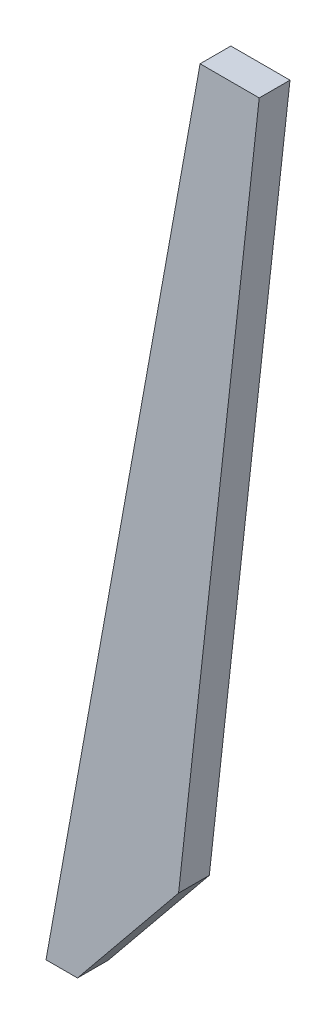
ISO-10303-21;
HEADER;
FILE_DESCRIPTION(('STEP AP214'),'2;1');
FILE_NAME('part.step','',(''),(''),'','','');
FILE_SCHEMA(('AUTOMOTIVE_DESIGN { 1 0 10303 214 1 1 1 1 }'));
ENDSEC;
DATA;
#1=APPLICATION_CONTEXT('core data for automotive mechanical design processes');
#2=APPLICATION_PROTOCOL_DEFINITION('international standard','automotive_design',2000,#1);
#3=PRODUCT_CONTEXT('',#1,'mechanical');
#4=PRODUCT('Part','Part','',(#3));
#5=PRODUCT_RELATED_PRODUCT_CATEGORY('part','',(#4));
#6=PRODUCT_DEFINITION_FORMATION('','',#4);
#7=PRODUCT_DEFINITION_CONTEXT('part definition',#1,'design');
#8=PRODUCT_DEFINITION('design','',#6,#7);
#9=PRODUCT_DEFINITION_SHAPE('','',#8);
#10=(LENGTH_UNIT() NAMED_UNIT(*) SI_UNIT(.MILLI.,.METRE.));
#11=(NAMED_UNIT(*) PLANE_ANGLE_UNIT() SI_UNIT($,.RADIAN.));
#12=(NAMED_UNIT(*) SI_UNIT($,.STERADIAN.) SOLID_ANGLE_UNIT());
#13=UNCERTAINTY_MEASURE_WITH_UNIT(LENGTH_MEASURE(1.E-05),#10,'distance_accuracy_value','');
#14=(GEOMETRIC_REPRESENTATION_CONTEXT(3) GLOBAL_UNCERTAINTY_ASSIGNED_CONTEXT((#13)) GLOBAL_UNIT_ASSIGNED_CONTEXT((#10,
#11,#12)) REPRESENTATION_CONTEXT('',''));
#15=CARTESIAN_POINT('',(0.,0.,0.));
#16=DIRECTION('',(0.,0.,1.));
#17=DIRECTION('',(1.,0.,0.));
#18=AXIS2_PLACEMENT_3D('',#15,#16,#17);
#19=CARTESIAN_POINT('',(364.335867611017,328.56027455063,12.));
#20=DIRECTION('',(0.,-1.,0.));
#21=DIRECTION('',(0.,0.,-1.));
#22=AXIS2_PLACEMENT_3D('',#19,#20,#21);
#23=PLANE('',#22);
#24=DIRECTION('',(-1.,0.,0.));
#25=VECTOR('',#24,1.);
#26=CARTESIAN_POINT('',(364.335867611017,328.56027455063,3.));
#27=LINE('',#26,#25);
#28=CARTESIAN_POINT('',(381.641222661209,328.56027455063,3.));
#29=VERTEX_POINT('',#28);
#30=CARTESIAN_POINT('',(364.335867611017,328.56027455063,3.));
#31=VERTEX_POINT('',#30);
#32=EDGE_CURVE('E111',#29,#31,#27,.T.);
#33=ORIENTED_EDGE('',*,*,#32,.T.);
#34=DIRECTION('',(0.,0.,-1.));
#35=VECTOR('',#34,1.);
#36=CARTESIAN_POINT('',(364.335867611017,328.56027455063,12.));
#37=LINE('',#36,#35);
#38=CARTESIAN_POINT('',(364.335867611017,328.56027455063,12.));
#39=VERTEX_POINT('',#38);
#40=EDGE_CURVE('E11',#39,#31,#37,.T.);
#41=ORIENTED_EDGE('',*,*,#40,.F.);
#42=DIRECTION('',(-1.,0.,0.));
#43=VECTOR('',#42,1.);
#44=CARTESIAN_POINT('',(364.335867611017,328.56027455063,12.));
#45=LINE('',#44,#43);
#46=CARTESIAN_POINT('',(381.641222661209,328.56027455063,12.));
#47=VERTEX_POINT('',#46);
#48=EDGE_CURVE('E119',#47,#39,#45,.T.);
#49=ORIENTED_EDGE('',*,*,#48,.F.);
#50=DIRECTION('',(0.,0.,-1.));
#51=VECTOR('',#50,1.);
#52=CARTESIAN_POINT('',(381.641222661209,328.56027455063,12.));
#53=LINE('',#52,#51);
#54=EDGE_CURVE('E107',#47,#29,#53,.T.);
#55=ORIENTED_EDGE('',*,*,#54,.T.);
#56=EDGE_LOOP('',(#33,#41,#49,#55));
#57=FACE_BOUND('',#56,.T.);
#58=ADVANCED_FACE('F37',(#57),#23,.F.);
#59=CARTESIAN_POINT('',(319.253193023551,78.9602745506298,12.));
#60=DIRECTION('',(0.984076823550579,-0.177743650661851,0.));
#61=DIRECTION('',(0.177743650661851,0.984076823550579,0.));
#62=AXIS2_PLACEMENT_3D('',#59,#60,#61);
#63=PLANE('',#62);
#64=DIRECTION('',(-0.177743650661851,-0.984076823550579,0.));
#65=VECTOR('',#64,1.);
#66=CARTESIAN_POINT('',(319.253193023551,78.9602745506298,3.));
#67=LINE('',#66,#65);
#68=CARTESIAN_POINT('',(319.253193023551,78.9602745506298,3.));
#69=VERTEX_POINT('',#68);
#70=EDGE_CURVE('E114',#31,#69,#67,.T.);
#71=ORIENTED_EDGE('',*,*,#70,.T.);
#72=DIRECTION('',(0.,0.,-1.));
#73=VECTOR('',#72,1.);
#74=CARTESIAN_POINT('',(319.253193023551,78.9602745506298,12.));
#75=LINE('',#74,#73);
#76=CARTESIAN_POINT('',(319.253193023551,78.9602745506298,12.));
#77=VERTEX_POINT('',#76);
#78=EDGE_CURVE('E45',#77,#69,#75,.T.);
#79=ORIENTED_EDGE('',*,*,#78,.F.);
#80=DIRECTION('',(-0.177743650661851,-0.984076823550579,0.));
#81=VECTOR('',#80,1.);
#82=CARTESIAN_POINT('',(319.253193023551,78.9602745506298,12.));
#83=LINE('',#82,#81);
#84=EDGE_CURVE('E87',#39,#77,#83,.T.);
#85=ORIENTED_EDGE('',*,*,#84,.F.);
#86=ORIENTED_EDGE('',*,*,#40,.T.);
#87=EDGE_LOOP('',(#71,#79,#85,#86));
#88=FACE_BOUND('',#87,.T.);
#89=ADVANCED_FACE('F138',(#88),#63,.F.);
#90=CARTESIAN_POINT('',(328.461797390898,78.9602745506298,12.));
#91=DIRECTION('',(0.,1.,0.));
#92=DIRECTION('',(-1.,0.,0.));
#93=AXIS2_PLACEMENT_3D('',#90,#91,#92);
#94=PLANE('',#93);
#95=DIRECTION('',(1.,0.,0.));
#96=VECTOR('',#95,1.);
#97=CARTESIAN_POINT('',(328.461797390898,78.9602745506298,3.));
#98=LINE('',#97,#96);
#99=CARTESIAN_POINT('',(328.461797390898,78.9602745506298,3.));
#100=VERTEX_POINT('',#99);
#101=EDGE_CURVE('E102',#69,#100,#98,.T.);
#102=ORIENTED_EDGE('',*,*,#101,.T.);
#103=DIRECTION('',(0.,0.,-1.));
#104=VECTOR('',#103,1.);
#105=CARTESIAN_POINT('',(328.461797390898,78.9602745506298,12.));
#106=LINE('',#105,#104);
#107=CARTESIAN_POINT('',(328.461797390898,78.9602745506298,12.));
#108=VERTEX_POINT('',#107);
#109=EDGE_CURVE('E99',#108,#100,#106,.T.);
#110=ORIENTED_EDGE('',*,*,#109,.F.);
#111=DIRECTION('',(1.,0.,0.));
#112=VECTOR('',#111,1.);
#113=CARTESIAN_POINT('',(328.461797390898,78.9602745506298,12.));
#114=LINE('',#113,#112);
#115=EDGE_CURVE('E91',#77,#108,#114,.T.);
#116=ORIENTED_EDGE('',*,*,#115,.F.);
#117=ORIENTED_EDGE('',*,*,#78,.T.);
#118=EDGE_LOOP('',(#102,#110,#116,#117));
#119=FACE_BOUND('',#118,.T.);
#120=ADVANCED_FACE('F100',(#119),#94,.F.);
#121=CARTESIAN_POINT('',(328.461797390898,78.9602745506298,12.));
#122=DIRECTION('',(-0.775230120030378,0.631678922394666,0.));
#123=DIRECTION('',(-0.631678922394666,-0.775230120030378,0.));
#124=AXIS2_PLACEMENT_3D('',#121,#122,#123);
#125=PLANE('',#124);
#126=DIRECTION('',(0.631678922394665,0.775230120030378,0.));
#127=VECTOR('',#126,1.);
#128=CARTESIAN_POINT('',(328.461797390898,78.9602745506298,3.));
#129=LINE('',#128,#127);
#130=CARTESIAN_POINT('',(358.034956049599,115.254034756765,3.));
#131=VERTEX_POINT('',#130);
#132=EDGE_CURVE('E73',#100,#131,#129,.T.);
#133=ORIENTED_EDGE('',*,*,#132,.T.);
#134=DIRECTION('',(0.,0.,-1.));
#135=VECTOR('',#134,1.);
#136=CARTESIAN_POINT('',(358.034956049599,115.254034756765,12.));
#137=LINE('',#136,#135);
#138=CARTESIAN_POINT('',(358.034956049599,115.254034756765,12.));
#139=VERTEX_POINT('',#138);
#140=EDGE_CURVE('E103',#139,#131,#137,.T.);
#141=ORIENTED_EDGE('',*,*,#140,.F.);
#142=DIRECTION('',(0.631678922394665,0.775230120030378,0.));
#143=VECTOR('',#142,1.);
#144=CARTESIAN_POINT('',(328.461797390898,78.9602745506298,12.));
#145=LINE('',#144,#143);
#146=EDGE_CURVE('E95',#108,#139,#145,.T.);
#147=ORIENTED_EDGE('',*,*,#146,.F.);
#148=ORIENTED_EDGE('',*,*,#109,.T.);
#149=EDGE_LOOP('',(#133,#141,#147,#148));
#150=FACE_BOUND('',#149,.T.);
#151=ADVANCED_FACE('F105',(#150),#125,.F.);
#152=CARTESIAN_POINT('',(381.641222661209,328.56027455063,12.));
#153=DIRECTION('',(-0.993931931791742,0.109996886159276,0.));
#154=DIRECTION('',(-0.109996886159276,-0.993931931791742,0.));
#155=AXIS2_PLACEMENT_3D('',#152,#153,#154);
#156=PLANE('',#155);
#157=DIRECTION('',(0.109996886159276,0.993931931791742,0.));
#158=VECTOR('',#157,1.);
#159=CARTESIAN_POINT('',(381.641222661209,328.56027455063,3.));
#160=LINE('',#159,#158);
#161=EDGE_CURVE('E79',#131,#29,#160,.T.);
#162=ORIENTED_EDGE('',*,*,#161,.T.);
#163=ORIENTED_EDGE('',*,*,#54,.F.);
#164=DIRECTION('',(0.109996886159276,0.993931931791742,0.));
#165=VECTOR('',#164,1.);
#166=CARTESIAN_POINT('',(381.641222661209,328.56027455063,12.));
#167=LINE('',#166,#165);
#168=EDGE_CURVE('E53',#139,#47,#167,.T.);
#169=ORIENTED_EDGE('',*,*,#168,.F.);
#170=ORIENTED_EDGE('',*,*,#140,.T.);
#171=EDGE_LOOP('',(#162,#163,#169,#170));
#172=FACE_BOUND('',#171,.T.);
#173=ADVANCED_FACE('F127',(#172),#156,.F.);
#174=CARTESIAN_POINT('',(141.294901962196,78.9602745506298,12.));
#175=DIRECTION('',(0.,0.,-1.));
#176=DIRECTION('',(-1.,0.,0.));
#177=AXIS2_PLACEMENT_3D('',#174,#175,#176);
#178=PLANE('',#177);
#179=ORIENTED_EDGE('',*,*,#48,.T.);
#180=ORIENTED_EDGE('',*,*,#84,.T.);
#181=ORIENTED_EDGE('',*,*,#115,.T.);
#182=ORIENTED_EDGE('',*,*,#146,.T.);
#183=ORIENTED_EDGE('',*,*,#168,.T.);
#184=EDGE_LOOP('',(#179,#180,#181,#182,#183));
#185=FACE_BOUND('',#184,.T.);
#186=ADVANCED_FACE('F93',(#185),#178,.F.);
#187=CARTESIAN_POINT('',(141.294901962196,78.9602745506298,3.));
#188=DIRECTION('',(0.,0.,-1.));
#189=DIRECTION('',(-1.,0.,0.));
#190=AXIS2_PLACEMENT_3D('',#187,#188,#189);
#191=PLANE('',#190);
#192=ORIENTED_EDGE('',*,*,#32,.F.);
#193=ORIENTED_EDGE('',*,*,#161,.F.);
#194=ORIENTED_EDGE('',*,*,#132,.F.);
#195=ORIENTED_EDGE('',*,*,#101,.F.);
#196=ORIENTED_EDGE('',*,*,#70,.F.);
#197=EDGE_LOOP('',(#192,#193,#194,#195,#196));
#198=FACE_BOUND('',#197,.T.);
#199=ADVANCED_FACE('F123',(#198),#191,.T.);
#200=CLOSED_SHELL('',(#58,#89,#120,#151,#173,#186,#199));
#201=MANIFOLD_SOLID_BREP('B2',#200);
#202=ADVANCED_BREP_SHAPE_REPRESENTATION('',(#18,#201),#14);
#203=SHAPE_DEFINITION_REPRESENTATION(#9,#202);
ENDSEC;
END-ISO-10303-21;
